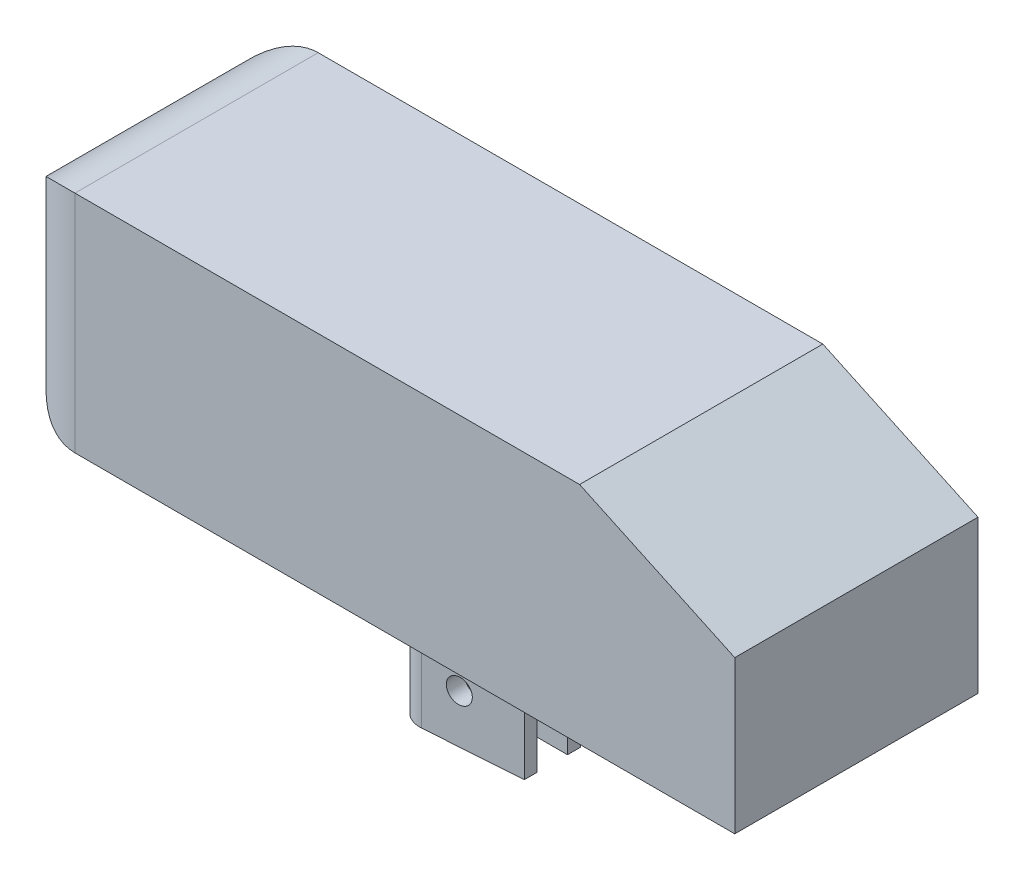
ISO-10303-21;
HEADER;
FILE_DESCRIPTION(('STEP AP214'),'2;1');
FILE_NAME('part.step','',(''),(''),'','','');
FILE_SCHEMA(('AUTOMOTIVE_DESIGN { 1 0 10303 214 1 1 1 1 }'));
ENDSEC;
DATA;
#1=APPLICATION_CONTEXT('core data for automotive mechanical design processes');
#2=APPLICATION_PROTOCOL_DEFINITION('international standard','automotive_design',2000,#1);
#3=PRODUCT_CONTEXT('',#1,'mechanical');
#4=PRODUCT('Part','Part','',(#3));
#5=PRODUCT_RELATED_PRODUCT_CATEGORY('part','',(#4));
#6=PRODUCT_DEFINITION_FORMATION('','',#4);
#7=PRODUCT_DEFINITION_CONTEXT('part definition',#1,'design');
#8=PRODUCT_DEFINITION('design','',#6,#7);
#9=PRODUCT_DEFINITION_SHAPE('','',#8);
#10=(LENGTH_UNIT() NAMED_UNIT(*) SI_UNIT(.MILLI.,.METRE.));
#11=(NAMED_UNIT(*) PLANE_ANGLE_UNIT() SI_UNIT($,.RADIAN.));
#12=(NAMED_UNIT(*) SI_UNIT($,.STERADIAN.) SOLID_ANGLE_UNIT());
#13=UNCERTAINTY_MEASURE_WITH_UNIT(LENGTH_MEASURE(1.E-05),#10,'distance_accuracy_value','');
#14=(GEOMETRIC_REPRESENTATION_CONTEXT(3) GLOBAL_UNCERTAINTY_ASSIGNED_CONTEXT((#13)) GLOBAL_UNIT_ASSIGNED_CONTEXT((#10,
#11,#12)) REPRESENTATION_CONTEXT('',''));
#15=CARTESIAN_POINT('',(0.,0.,0.));
#16=DIRECTION('',(0.,0.,1.));
#17=DIRECTION('',(1.,0.,0.));
#18=AXIS2_PLACEMENT_3D('',#15,#16,#17);
#19=CARTESIAN_POINT('',(5.59465020505335,113.389734504571,-6.));
#20=DIRECTION('',(-1.,0.,0.));
#21=DIRECTION('',(0.,0.,1.));
#22=AXIS2_PLACEMENT_3D('',#19,#20,#21);
#23=PLANE('',#22);
#24=DIRECTION('',(0.,0.,1.));
#25=VECTOR('',#24,1.);
#26=CARTESIAN_POINT('',(5.59465020505335,113.389734504571,-6.));
#27=LINE('',#26,#25);
#28=CARTESIAN_POINT('',(5.59465020505334,113.389734504571,-4.60146376112993));
#29=VERTEX_POINT('',#28);
#30=CARTESIAN_POINT('',(5.59465020505335,113.389734504571,-2.5));
#31=VERTEX_POINT('',#30);
#32=EDGE_CURVE('E167',#29,#31,#27,.T.);
#33=ORIENTED_EDGE('',*,*,#32,.F.);
#34=DIRECTION('',(0.,1.,0.));
#35=VECTOR('',#34,1.);
#36=CARTESIAN_POINT('',(5.59465020505335,113.389734504571,-4.60146376112993));
#37=LINE('',#36,#35);
#38=CARTESIAN_POINT('',(5.59465020505335,138.389734504571,-4.60146376112993));
#39=VERTEX_POINT('',#38);
#40=EDGE_CURVE('E146',#29,#39,#37,.T.);
#41=ORIENTED_EDGE('',*,*,#40,.T.);
#42=DIRECTION('',(0.,0.,1.));
#43=VECTOR('',#42,1.);
#44=CARTESIAN_POINT('',(5.59465020505335,138.389734504571,-6.));
#45=LINE('',#44,#43);
#46=CARTESIAN_POINT('',(5.59465020505335,138.389734504571,-2.5));
#47=VERTEX_POINT('',#46);
#48=EDGE_CURVE('E182',#39,#47,#45,.T.);
#49=ORIENTED_EDGE('',*,*,#48,.T.);
#50=DIRECTION('',(0.,1.,0.));
#51=VECTOR('',#50,1.);
#52=CARTESIAN_POINT('',(5.59465020505335,113.389734504571,-2.5));
#53=LINE('',#52,#51);
#54=EDGE_CURVE('E173',#31,#47,#53,.T.);
#55=ORIENTED_EDGE('',*,*,#54,.F.);
#56=EDGE_LOOP('',(#33,#41,#49,#55));
#57=FACE_BOUND('',#56,.T.);
#58=ADVANCED_FACE('F42',(#57),#23,.F.);
#59=CARTESIAN_POINT('',(5.59465020505335,138.389734504571,2.50000000000001));
#60=VERTEX_POINT('',#59);
#61=CARTESIAN_POINT('',(5.59465020505336,138.389734504571,4.60146376112993));
#62=VERTEX_POINT('',#61);
#63=EDGE_CURVE('E186',#60,#62,#45,.T.);
#64=ORIENTED_EDGE('',*,*,#63,.T.);
#65=DIRECTION('',(0.,-1.,0.));
#66=VECTOR('',#65,1.);
#67=CARTESIAN_POINT('',(5.59465020505335,113.389734504571,4.60146376112994));
#68=LINE('',#67,#66);
#69=CARTESIAN_POINT('',(5.59465020505335,113.389734504571,4.60146376112994));
#70=VERTEX_POINT('',#69);
#71=EDGE_CURVE('E253',#62,#70,#68,.T.);
#72=ORIENTED_EDGE('',*,*,#71,.T.);
#73=CARTESIAN_POINT('',(5.59465020505335,113.389734504571,2.5));
#74=VERTEX_POINT('',#73);
#75=EDGE_CURVE('E180',#74,#70,#27,.T.);
#76=ORIENTED_EDGE('',*,*,#75,.F.);
#77=DIRECTION('',(0.,-1.,0.));
#78=VECTOR('',#77,1.);
#79=CARTESIAN_POINT('',(5.59465020505335,113.389734504571,2.5));
#80=LINE('',#79,#78);
#81=EDGE_CURVE('E269',#60,#74,#80,.T.);
#82=ORIENTED_EDGE('',*,*,#81,.F.);
#83=EDGE_LOOP('',(#64,#72,#76,#82));
#84=FACE_BOUND('',#83,.T.);
#85=ADVANCED_FACE('F284',(#84),#23,.F.);
#86=CARTESIAN_POINT('',(0.,113.389734504571,0.));
#87=DIRECTION('',(0.,-1.,0.));
#88=DIRECTION('',(0.,0.,-1.));
#89=AXIS2_PLACEMENT_3D('',#86,#87,#88);
#90=PLANE('',#89);
#91=DIRECTION('',(0.997564050259825,0.,-0.0697564737441182));
#92=VECTOR('',#91,1.);
#93=CARTESIAN_POINT('',(-14.4053497949467,113.389734504571,6.));
#94=LINE('',#93,#92);
#95=CARTESIAN_POINT('',(-10.2039180970502,113.389734504571,5.70620727576772));
#96=VERTEX_POINT('',#95);
#97=EDGE_CURVE('E172',#96,#70,#94,.T.);
#98=ORIENTED_EDGE('',*,*,#97,.F.);
#99=CARTESIAN_POINT('',(-10.4829439920267,113.389734504571,1.71595107472842));
#100=DIRECTION('',(0.,-1.,0.));
#101=DIRECTION('',(0.,0.,-1.));
#102=AXIS2_PLACEMENT_3D('',#99,#100,#101);
#103=CIRCLE('',#102,4.);
#104=CARTESIAN_POINT('',(-14.4053497949467,113.389734504571,2.5));
#105=VERTEX_POINT('',#104);
#106=EDGE_CURVE('E263',#96,#105,#103,.T.);
#107=ORIENTED_EDGE('',*,*,#106,.T.);
#108=DIRECTION('',(1.,0.,0.));
#109=VECTOR('',#108,1.);
#110=CARTESIAN_POINT('',(-24.4053497949466,113.389734504571,2.5));
#111=LINE('',#110,#109);
#112=EDGE_CURVE('E490',#105,#74,#111,.T.);
#113=ORIENTED_EDGE('',*,*,#112,.T.);
#114=ORIENTED_EDGE('',*,*,#75,.T.);
#115=EDGE_LOOP('',(#98,#107,#113,#114));
#116=FACE_BOUND('',#115,.T.);
#117=ADVANCED_FACE('F288',(#116),#90,.T.);
#118=CARTESIAN_POINT('',(-4.40534979494665,138.389734504571,0.));
#119=DIRECTION('',(0.,1.,0.));
#120=DIRECTION('',(0.,0.,1.));
#121=AXIS2_PLACEMENT_3D('',#118,#119,#120);
#122=PLANE('',#121);
#123=ORIENTED_EDGE('',*,*,#48,.F.);
#124=DIRECTION('',(-0.997564050259825,0.,-0.0697564737441185));
#125=VECTOR('',#124,1.);
#126=CARTESIAN_POINT('',(20.5946502050534,138.389734504571,-3.55256158197738));
#127=LINE('',#126,#125);
#128=CARTESIAN_POINT('',(-10.2039180970502,138.389734504571,-5.70620727576772));
#129=VERTEX_POINT('',#128);
#130=EDGE_CURVE('E157',#39,#129,#127,.T.);
#131=ORIENTED_EDGE('',*,*,#130,.T.);
#132=CARTESIAN_POINT('',(-10.4829439920267,138.389734504571,-1.71595107472842));
#133=DIRECTION('',(0.,1.,0.));
#134=DIRECTION('',(0.,0.,1.));
#135=AXIS2_PLACEMENT_3D('',#132,#133,#134);
#136=CIRCLE('',#135,4.);
#137=CARTESIAN_POINT('',(-14.4053497949467,138.389734504571,-2.5));
#138=VERTEX_POINT('',#137);
#139=EDGE_CURVE('E55',#129,#138,#136,.T.);
#140=ORIENTED_EDGE('',*,*,#139,.T.);
#141=DIRECTION('',(1.,0.,0.));
#142=VECTOR('',#141,1.);
#143=CARTESIAN_POINT('',(-24.4053497949466,138.389734504571,-2.5));
#144=LINE('',#143,#142);
#145=EDGE_CURVE('E184',#138,#47,#144,.T.);
#146=ORIENTED_EDGE('',*,*,#145,.T.);
#147=EDGE_LOOP('',(#123,#131,#140,#146));
#148=FACE_BOUND('',#147,.T.);
#149=DIRECTION('',(1.,0.,0.));
#150=VECTOR('',#149,1.);
#151=CARTESIAN_POINT('',(-24.4053497949466,138.389734504571,2.50000000000002));
#152=LINE('',#151,#150);
#153=CARTESIAN_POINT('',(-14.4053497949467,138.389734504571,2.50000000000001));
#154=VERTEX_POINT('',#153);
#155=EDGE_CURVE('E267',#154,#60,#152,.T.);
#156=ORIENTED_EDGE('',*,*,#155,.F.);
#157=CARTESIAN_POINT('',(-10.4829439920267,138.389734504571,1.71595107472844));
#158=DIRECTION('',(0.,1.,0.));
#159=DIRECTION('',(0.,0.,1.));
#160=AXIS2_PLACEMENT_3D('',#157,#158,#159);
#161=CIRCLE('',#160,4.);
#162=CARTESIAN_POINT('',(-10.2039180970502,138.389734504571,5.70620727576772));
#163=VERTEX_POINT('',#162);
#164=EDGE_CURVE('E12',#154,#163,#161,.T.);
#165=ORIENTED_EDGE('',*,*,#164,.T.);
#166=DIRECTION('',(0.997564050259825,0.,-0.0697564737441182));
#167=VECTOR('',#166,1.);
#168=CARTESIAN_POINT('',(-14.4053497949467,138.389734504571,6.));
#169=LINE('',#168,#167);
#170=EDGE_CURVE('E168',#163,#62,#169,.T.);
#171=ORIENTED_EDGE('',*,*,#170,.T.);
#172=ORIENTED_EDGE('',*,*,#63,.F.);
#173=EDGE_LOOP('',(#156,#165,#171,#172));
#174=FACE_BOUND('',#173,.T.);
#175=DIRECTION('',(1.,0.,0.));
#176=VECTOR('',#175,1.);
#177=CARTESIAN_POINT('',(-64.4353497949467,138.389734504571,20.01));
#178=LINE('',#177,#176);
#179=CARTESIAN_POINT('',(-52.9353497949467,138.389734504571,20.01));
#180=VERTEX_POINT('',#179);
#181=CARTESIAN_POINT('',(55.6246502050534,138.389734504571,20.01));
#182=VERTEX_POINT('',#181);
#183=EDGE_CURVE('E194',#180,#182,#178,.T.);
#184=ORIENTED_EDGE('',*,*,#183,.F.);
#185=DIRECTION('',(0.,0.,1.));
#186=VECTOR('',#185,1.);
#187=CARTESIAN_POINT('',(-52.9353497949467,138.389734504571,0.));
#188=LINE('',#187,#186);
#189=CARTESIAN_POINT('',(-52.9353497949467,138.389734504571,-20.01));
#190=VERTEX_POINT('',#189);
#191=EDGE_CURVE('E230',#180,#190,#188,.F.);
#192=ORIENTED_EDGE('',*,*,#191,.T.);
#193=DIRECTION('',(1.,0.,0.));
#194=VECTOR('',#193,1.);
#195=CARTESIAN_POINT('',(-64.4353497949467,138.389734504571,-20.01));
#196=LINE('',#195,#194);
#197=CARTESIAN_POINT('',(55.6246502050534,138.389734504571,-20.01));
#198=VERTEX_POINT('',#197);
#199=EDGE_CURVE('E195',#190,#198,#196,.T.);
#200=ORIENTED_EDGE('',*,*,#199,.T.);
#201=DIRECTION('',(0.,0.,1.));
#202=VECTOR('',#201,1.);
#203=CARTESIAN_POINT('',(55.6246502050534,138.389734504571,-20.01));
#204=LINE('',#203,#202);
#205=EDGE_CURVE('E200',#198,#182,#204,.T.);
#206=ORIENTED_EDGE('',*,*,#205,.T.);
#207=EDGE_LOOP('',(#184,#192,#200,#206));
#208=FACE_BOUND('',#207,.T.);
#209=ADVANCED_FACE('F262',(#148,#174,#208),#122,.F.);
#210=CARTESIAN_POINT('',(-64.4353497949467,175.408234504571,-20.01));
#211=DIRECTION('',(1.,0.,0.));
#212=DIRECTION('',(0.,0.,-1.));
#213=AXIS2_PLACEMENT_3D('',#210,#211,#212);
#214=PLANE('',#213);
#215=DIRECTION('',(0.,-1.,0.));
#216=VECTOR('',#215,1.);
#217=CARTESIAN_POINT('',(-64.4353497949467,138.389734504571,-8.51000000000003));
#218=LINE('',#217,#216);
#219=CARTESIAN_POINT('',(-64.4353497949467,163.908234504571,-8.51000000000003));
#220=VERTEX_POINT('',#219);
#221=CARTESIAN_POINT('',(-64.4353497949467,149.889734504571,-8.51000000000003));
#222=VERTEX_POINT('',#221);
#223=EDGE_CURVE('E224',#220,#222,#218,.T.);
#224=ORIENTED_EDGE('',*,*,#223,.T.);
#225=DIRECTION('',(0.,0.,1.));
#226=VECTOR('',#225,1.);
#227=CARTESIAN_POINT('',(-64.4353497949467,149.889734504571,-20.01));
#228=LINE('',#227,#226);
#229=CARTESIAN_POINT('',(-64.4353497949467,149.889734504571,8.50999999999997));
#230=VERTEX_POINT('',#229);
#231=EDGE_CURVE('E221',#222,#230,#228,.T.);
#232=ORIENTED_EDGE('',*,*,#231,.T.);
#233=DIRECTION('',(0.,-1.,0.));
#234=VECTOR('',#233,1.);
#235=CARTESIAN_POINT('',(-64.4353497949467,175.408234504571,8.50999999999997));
#236=LINE('',#235,#234);
#237=CARTESIAN_POINT('',(-64.4353497949467,163.908234504571,8.50999999999997));
#238=VERTEX_POINT('',#237);
#239=EDGE_CURVE('E219',#230,#238,#236,.F.);
#240=ORIENTED_EDGE('',*,*,#239,.T.);
#241=DIRECTION('',(0.,0.,1.));
#242=VECTOR('',#241,1.);
#243=CARTESIAN_POINT('',(-64.4353497949467,163.908234504571,-20.01));
#244=LINE('',#243,#242);
#245=EDGE_CURVE('E218',#238,#220,#244,.F.);
#246=ORIENTED_EDGE('',*,*,#245,.T.);
#247=EDGE_LOOP('',(#224,#232,#240,#246));
#248=FACE_BOUND('',#247,.T.);
#249=ADVANCED_FACE('F305',(#248),#214,.F.);
#250=CARTESIAN_POINT('',(-64.4353497949467,175.408234504571,20.01));
#251=DIRECTION('',(0.,0.,-1.));
#252=DIRECTION('',(-1.,0.,0.));
#253=AXIS2_PLACEMENT_3D('',#250,#251,#252);
#254=PLANE('',#253);
#255=DIRECTION('',(1.,0.,0.));
#256=VECTOR('',#255,1.);
#257=CARTESIAN_POINT('',(-64.4353497949467,175.408234504571,20.01));
#258=LINE('',#257,#256);
#259=CARTESIAN_POINT('',(-52.9353497949467,175.408234504571,20.01));
#260=VERTEX_POINT('',#259);
#261=CARTESIAN_POINT('',(30.0946502050532,175.408234504571,20.01));
#262=VERTEX_POINT('',#261);
#263=EDGE_CURVE('E189',#260,#262,#258,.T.);
#264=ORIENTED_EDGE('',*,*,#263,.F.);
#265=DIRECTION('',(0.,-1.,0.));
#266=VECTOR('',#265,1.);
#267=CARTESIAN_POINT('',(-52.9353497949467,175.408234504571,20.01));
#268=LINE('',#267,#266);
#269=EDGE_CURVE('E234',#260,#180,#268,.T.);
#270=ORIENTED_EDGE('',*,*,#269,.T.);
#271=ORIENTED_EDGE('',*,*,#183,.T.);
#272=DIRECTION('',(0.,-1.,0.));
#273=VECTOR('',#272,1.);
#274=CARTESIAN_POINT('',(55.6246502050534,175.408234504571,20.01));
#275=LINE('',#274,#273);
#276=CARTESIAN_POINT('',(55.6246502050534,163.503399991874,20.01));
#277=VERTEX_POINT('',#276);
#278=EDGE_CURVE('E203',#277,#182,#275,.T.);
#279=ORIENTED_EDGE('',*,*,#278,.F.);
#280=DIRECTION('',(0.906307787036651,-0.422618261740697,0.));
#281=VECTOR('',#280,1.);
#282=CARTESIAN_POINT('',(55.6246502050534,163.503399991874,20.01));
#283=LINE('',#282,#281);
#284=EDGE_CURVE('E208',#277,#262,#283,.F.);
#285=ORIENTED_EDGE('',*,*,#284,.T.);
#286=EDGE_LOOP('',(#264,#270,#271,#279,#285));
#287=FACE_BOUND('',#286,.T.);
#288=ADVANCED_FACE('F309',(#287),#254,.F.);
#289=CARTESIAN_POINT('',(55.6246502050534,175.408234504571,-20.01));
#290=DIRECTION('',(1.,0.,0.));
#291=DIRECTION('',(0.,0.,-1.));
#292=AXIS2_PLACEMENT_3D('',#289,#290,#291);
#293=PLANE('',#292);
#294=DIRECTION('',(0.,-1.,0.));
#295=VECTOR('',#294,1.);
#296=CARTESIAN_POINT('',(55.6246502050534,175.408234504571,-20.01));
#297=LINE('',#296,#295);
#298=CARTESIAN_POINT('',(55.6246502050534,163.503399991874,-20.01));
#299=VERTEX_POINT('',#298);
#300=EDGE_CURVE('E192',#299,#198,#297,.T.);
#301=ORIENTED_EDGE('',*,*,#300,.F.);
#302=DIRECTION('',(0.,0.,1.));
#303=VECTOR('',#302,1.);
#304=CARTESIAN_POINT('',(55.6246502050534,163.503399991874,-20.01));
#305=LINE('',#304,#303);
#306=EDGE_CURVE('E210',#299,#277,#305,.T.);
#307=ORIENTED_EDGE('',*,*,#306,.T.);
#308=ORIENTED_EDGE('',*,*,#278,.T.);
#309=ORIENTED_EDGE('',*,*,#205,.F.);
#310=EDGE_LOOP('',(#301,#307,#308,#309));
#311=FACE_BOUND('',#310,.T.);
#312=ADVANCED_FACE('F301',(#311),#293,.T.);
#313=CARTESIAN_POINT('',(-64.4353497949467,175.408234504571,-20.01));
#314=DIRECTION('',(0.,0.,-1.));
#315=DIRECTION('',(-1.,0.,0.));
#316=AXIS2_PLACEMENT_3D('',#313,#314,#315);
#317=PLANE('',#316);
#318=ORIENTED_EDGE('',*,*,#199,.F.);
#319=DIRECTION('',(0.,-1.,0.));
#320=VECTOR('',#319,1.);
#321=CARTESIAN_POINT('',(-52.9353497949467,175.408234504571,-20.01));
#322=LINE('',#321,#320);
#323=CARTESIAN_POINT('',(-52.9353497949467,175.408234504571,-20.01));
#324=VERTEX_POINT('',#323);
#325=EDGE_CURVE('E226',#190,#324,#322,.F.);
#326=ORIENTED_EDGE('',*,*,#325,.T.);
#327=DIRECTION('',(1.,0.,0.));
#328=VECTOR('',#327,1.);
#329=CARTESIAN_POINT('',(-64.4353497949467,175.408234504571,-20.01));
#330=LINE('',#329,#328);
#331=CARTESIAN_POINT('',(30.0946502050532,175.408234504571,-20.01));
#332=VERTEX_POINT('',#331);
#333=EDGE_CURVE('E191',#324,#332,#330,.T.);
#334=ORIENTED_EDGE('',*,*,#333,.T.);
#335=DIRECTION('',(-0.906307787036651,0.422618261740697,0.));
#336=VECTOR('',#335,1.);
#337=CARTESIAN_POINT('',(-47.5517061667811,211.615325108589,-20.01));
#338=LINE('',#337,#336);
#339=EDGE_CURVE('E217',#332,#299,#338,.F.);
#340=ORIENTED_EDGE('',*,*,#339,.T.);
#341=ORIENTED_EDGE('',*,*,#300,.T.);
#342=EDGE_LOOP('',(#318,#326,#334,#340,#341));
#343=FACE_BOUND('',#342,.T.);
#344=ADVANCED_FACE('F300',(#343),#317,.T.);
#345=CARTESIAN_POINT('',(-4.40534979494665,175.408234504571,0.));
#346=DIRECTION('',(0.,1.,0.));
#347=DIRECTION('',(0.,0.,1.));
#348=AXIS2_PLACEMENT_3D('',#345,#346,#347);
#349=PLANE('',#348);
#350=ORIENTED_EDGE('',*,*,#333,.F.);
#351=DIRECTION('',(0.,0.,1.));
#352=VECTOR('',#351,1.);
#353=CARTESIAN_POINT('',(-52.9353497949467,175.408234504571,20.01));
#354=LINE('',#353,#352);
#355=EDGE_CURVE('E235',#324,#260,#354,.T.);
#356=ORIENTED_EDGE('',*,*,#355,.T.);
#357=ORIENTED_EDGE('',*,*,#263,.T.);
#358=DIRECTION('',(0.,0.,-1.));
#359=VECTOR('',#358,1.);
#360=CARTESIAN_POINT('',(30.0946502050532,175.408234504571,0.));
#361=LINE('',#360,#359);
#362=EDGE_CURVE('E215',#262,#332,#361,.T.);
#363=ORIENTED_EDGE('',*,*,#362,.T.);
#364=EDGE_LOOP('',(#350,#356,#357,#363));
#365=FACE_BOUND('',#364,.T.);
#366=ADVANCED_FACE('F291',(#365),#349,.T.);
#367=CARTESIAN_POINT('',(55.6246502050534,163.503399991874,-20.01));
#368=DIRECTION('',(-0.422618261740697,-0.906307787036651,0.));
#369=DIRECTION('',(0.,0.,1.));
#370=AXIS2_PLACEMENT_3D('',#367,#368,#369);
#371=PLANE('',#370);
#372=ORIENTED_EDGE('',*,*,#339,.F.);
#373=ORIENTED_EDGE('',*,*,#362,.F.);
#374=ORIENTED_EDGE('',*,*,#284,.F.);
#375=ORIENTED_EDGE('',*,*,#306,.F.);
#376=EDGE_LOOP('',(#372,#373,#374,#375));
#377=FACE_BOUND('',#376,.T.);
#378=ADVANCED_FACE('F299',(#377),#371,.F.);
#379=CARTESIAN_POINT('',(-52.9353497949467,163.908234504571,0.));
#380=DIRECTION('',(0.,0.,-1.));
#381=DIRECTION('',(-1.,0.,0.));
#382=AXIS2_PLACEMENT_3D('',#379,#380,#381);
#383=CYLINDRICAL_SURFACE('',#382,11.5);
#384=CARTESIAN_POINT('',(-52.9353497949467,163.908234504571,8.50999999999997));
#385=DIRECTION('',(0.,-0.707106781186547,0.707106781186547));
#386=DIRECTION('',(0.,-0.707106781186547,-0.707106781186547));
#387=AXIS2_PLACEMENT_3D('',#384,#385,#386);
#388=ELLIPSE('',#387,16.2634559672906,11.5);
#389=EDGE_CURVE('E240',#260,#238,#388,.T.);
#390=ORIENTED_EDGE('',*,*,#389,.F.);
#391=ORIENTED_EDGE('',*,*,#355,.F.);
#392=CARTESIAN_POINT('',(-52.9353497949467,163.908234504571,-8.51000000000003));
#393=DIRECTION('',(0.,-0.707106781186547,-0.707106781186547));
#394=DIRECTION('',(0.,0.707106781186547,-0.707106781186547));
#395=AXIS2_PLACEMENT_3D('',#392,#393,#394);
#396=ELLIPSE('',#395,16.2634559672906,11.5);
#397=EDGE_CURVE('E198',#220,#324,#396,.T.);
#398=ORIENTED_EDGE('',*,*,#397,.F.);
#399=ORIENTED_EDGE('',*,*,#245,.F.);
#400=EDGE_LOOP('',(#390,#391,#398,#399));
#401=FACE_BOUND('',#400,.T.);
#402=ADVANCED_FACE('F316',(#401),#383,.T.);
#403=CARTESIAN_POINT('',(-52.9353497949467,175.408234504571,-8.51000000000003));
#404=DIRECTION('',(0.,1.,0.));
#405=DIRECTION('',(0.,0.,1.));
#406=AXIS2_PLACEMENT_3D('',#403,#404,#405);
#407=CYLINDRICAL_SURFACE('',#406,11.5);
#408=ORIENTED_EDGE('',*,*,#397,.T.);
#409=ORIENTED_EDGE('',*,*,#325,.F.);
#410=CARTESIAN_POINT('',(-52.9353497949467,149.889734504571,-8.51000000000003));
#411=DIRECTION('',(0.,0.707106781186547,-0.707106781186547));
#412=DIRECTION('',(0.,0.707106781186547,0.707106781186547));
#413=AXIS2_PLACEMENT_3D('',#410,#411,#412);
#414=ELLIPSE('',#413,16.2634559672906,11.5);
#415=EDGE_CURVE('E179',#222,#190,#414,.F.);
#416=ORIENTED_EDGE('',*,*,#415,.F.);
#417=ORIENTED_EDGE('',*,*,#223,.F.);
#418=EDGE_LOOP('',(#408,#409,#416,#417));
#419=FACE_BOUND('',#418,.T.);
#420=ADVANCED_FACE('F330',(#419),#407,.T.);
#421=CARTESIAN_POINT('',(-52.9353497949467,175.408234504571,8.50999999999997));
#422=DIRECTION('',(0.,-1.,0.));
#423=DIRECTION('',(0.,0.,-1.));
#424=AXIS2_PLACEMENT_3D('',#421,#422,#423);
#425=CYLINDRICAL_SURFACE('',#424,11.5);
#426=ORIENTED_EDGE('',*,*,#389,.T.);
#427=ORIENTED_EDGE('',*,*,#239,.F.);
#428=CARTESIAN_POINT('',(-52.9353497949467,149.889734504571,8.50999999999997));
#429=DIRECTION('',(0.,-0.707106781186547,-0.707106781186547));
#430=DIRECTION('',(0.,-0.707106781186547,0.707106781186547));
#431=AXIS2_PLACEMENT_3D('',#428,#429,#430);
#432=ELLIPSE('',#431,16.2634559672906,11.5);
#433=EDGE_CURVE('E177',#180,#230,#432,.T.);
#434=ORIENTED_EDGE('',*,*,#433,.F.);
#435=ORIENTED_EDGE('',*,*,#269,.F.);
#436=EDGE_LOOP('',(#426,#427,#434,#435));
#437=FACE_BOUND('',#436,.T.);
#438=ADVANCED_FACE('F325',(#437),#425,.T.);
#439=CARTESIAN_POINT('',(-52.9353497949467,149.889734504571,-20.01));
#440=DIRECTION('',(0.,0.,1.));
#441=DIRECTION('',(1.,0.,0.));
#442=AXIS2_PLACEMENT_3D('',#439,#440,#441);
#443=CYLINDRICAL_SURFACE('',#442,11.5);
#444=ORIENTED_EDGE('',*,*,#415,.T.);
#445=ORIENTED_EDGE('',*,*,#191,.F.);
#446=ORIENTED_EDGE('',*,*,#433,.T.);
#447=ORIENTED_EDGE('',*,*,#231,.F.);
#448=EDGE_LOOP('',(#444,#445,#446,#447));
#449=FACE_BOUND('',#448,.T.);
#450=ADVANCED_FACE('F322',(#449),#443,.T.);
#451=DIRECTION('',(1.,0.,0.));
#452=VECTOR('',#451,1.);
#453=CARTESIAN_POINT('',(-24.4053497949466,113.389734504571,-2.5));
#454=LINE('',#453,#452);
#455=CARTESIAN_POINT('',(-14.4053497949467,113.389734504571,-2.5));
#456=VERTEX_POINT('',#455);
#457=EDGE_CURVE('E484',#456,#31,#454,.T.);
#458=ORIENTED_EDGE('',*,*,#457,.F.);
#459=CARTESIAN_POINT('',(-10.4829439920267,113.389734504571,-1.71595107472842));
#460=DIRECTION('',(0.,-1.,0.));
#461=DIRECTION('',(0.,0.,-1.));
#462=AXIS2_PLACEMENT_3D('',#459,#460,#461);
#463=CIRCLE('',#462,4.);
#464=CARTESIAN_POINT('',(-10.2039180970502,113.389734504571,-5.70620727576772));
#465=VERTEX_POINT('',#464);
#466=EDGE_CURVE('E166',#456,#465,#463,.T.);
#467=ORIENTED_EDGE('',*,*,#466,.T.);
#468=DIRECTION('',(-0.997564050259825,0.,-0.0697564737441185));
#469=VECTOR('',#468,1.);
#470=CARTESIAN_POINT('',(20.5946502050534,113.389734504571,-3.55256158197738));
#471=LINE('',#470,#469);
#472=EDGE_CURVE('E153',#29,#465,#471,.T.);
#473=ORIENTED_EDGE('',*,*,#472,.F.);
#474=ORIENTED_EDGE('',*,*,#32,.T.);
#475=EDGE_LOOP('',(#458,#467,#473,#474));
#476=FACE_BOUND('',#475,.T.);
#477=ADVANCED_FACE('F162',(#476),#90,.T.);
#478=CARTESIAN_POINT('',(-24.4053497949466,113.389734504571,-2.5));
#479=DIRECTION('',(0.,0.,-1.));
#480=DIRECTION('',(-1.,0.,0.));
#481=AXIS2_PLACEMENT_3D('',#478,#479,#480);
#482=PLANE('',#481);
#483=CARTESIAN_POINT('',(-4.40534979494665,121.389734504571,-2.5));
#484=DIRECTION('',(0.,0.,-1.));
#485=DIRECTION('',(-1.,0.,0.));
#486=AXIS2_PLACEMENT_3D('',#483,#484,#485);
#487=CIRCLE('',#486,2.);
#488=CARTESIAN_POINT('',(-6.40534979494665,121.389734504571,-2.5));
#489=VERTEX_POINT('',#488);
#490=EDGE_CURVE('E255',#489,#489,#487,.T.);
#491=ORIENTED_EDGE('',*,*,#490,.T.);
#492=EDGE_LOOP('',(#491));
#493=FACE_BOUND('',#492,.T.);
#494=ORIENTED_EDGE('',*,*,#457,.T.);
#495=ORIENTED_EDGE('',*,*,#54,.T.);
#496=ORIENTED_EDGE('',*,*,#145,.F.);
#497=DIRECTION('',(0.,1.,0.));
#498=VECTOR('',#497,1.);
#499=CARTESIAN_POINT('',(-14.4053497949467,113.389734504571,-2.5));
#500=LINE('',#499,#498);
#501=EDGE_CURVE('E243',#456,#138,#500,.T.);
#502=ORIENTED_EDGE('',*,*,#501,.F.);
#503=EDGE_LOOP('',(#494,#495,#496,#502));
#504=FACE_BOUND('',#503,.T.);
#505=ADVANCED_FACE('F268',(#493,#504),#482,.F.);
#506=CARTESIAN_POINT('',(-24.4053497949466,113.389734504571,2.5));
#507=DIRECTION('',(0.,0.,1.));
#508=DIRECTION('',(0.,-1.,0.));
#509=AXIS2_PLACEMENT_3D('',#506,#507,#508);
#510=PLANE('',#509);
#511=CARTESIAN_POINT('',(-4.40534979494665,121.389734504571,2.5));
#512=DIRECTION('',(0.,0.,1.));
#513=DIRECTION('',(0.,-1.,0.));
#514=AXIS2_PLACEMENT_3D('',#511,#512,#513);
#515=CIRCLE('',#514,2.);
#516=CARTESIAN_POINT('',(-4.40534979494665,119.389734504571,2.5));
#517=VERTEX_POINT('',#516);
#518=EDGE_CURVE('E246',#517,#517,#515,.T.);
#519=ORIENTED_EDGE('',*,*,#518,.T.);
#520=EDGE_LOOP('',(#519));
#521=FACE_BOUND('',#520,.T.);
#522=ORIENTED_EDGE('',*,*,#155,.T.);
#523=ORIENTED_EDGE('',*,*,#81,.T.);
#524=ORIENTED_EDGE('',*,*,#112,.F.);
#525=DIRECTION('',(0.,-1.,0.));
#526=VECTOR('',#525,1.);
#527=CARTESIAN_POINT('',(-14.4053497949467,113.389734504571,2.5));
#528=LINE('',#527,#526);
#529=EDGE_CURVE('E233',#154,#105,#528,.T.);
#530=ORIENTED_EDGE('',*,*,#529,.F.);
#531=EDGE_LOOP('',(#522,#523,#524,#530));
#532=FACE_BOUND('',#531,.T.);
#533=ADVANCED_FACE('F423',(#521,#532),#510,.F.);
#534=CARTESIAN_POINT('',(-4.40534979494665,121.389734504571,24.));
#535=DIRECTION('',(0.,0.,-1.));
#536=DIRECTION('',(-1.,0.,0.));
#537=AXIS2_PLACEMENT_3D('',#534,#535,#536);
#538=CYLINDRICAL_SURFACE('',#537,2.);
#539=CARTESIAN_POINT('',(-4.40534979494665,121.389734504571,5.30073188056497));
#540=DIRECTION('',(-0.0697564737441182,0.,-0.997564050259825));
#541=DIRECTION('',(0.997564050259825,0.,-0.0697564737441182));
#542=AXIS2_PLACEMENT_3D('',#539,#540,#541);
#543=ELLIPSE('',#542,2.00488379616234,2.);
#544=CARTESIAN_POINT('',(-2.40534979494665,121.389734504571,5.16087825667796));
#545=VERTEX_POINT('',#544);
#546=EDGE_CURVE('E158',#545,#545,#543,.F.);
#547=ORIENTED_EDGE('',*,*,#546,.T.);
#548=EDGE_LOOP('',(#547));
#549=FACE_BOUND('',#548,.T.);
#550=ORIENTED_EDGE('',*,*,#518,.F.);
#551=EDGE_LOOP('',(#550));
#552=FACE_BOUND('',#551,.T.);
#553=ADVANCED_FACE('F435',(#549,#552),#538,.F.);
#554=CARTESIAN_POINT('',(-4.40534979494665,121.389734504571,-5.30073188056497));
#555=DIRECTION('',(-0.0697564737441185,0.,0.997564050259825));
#556=DIRECTION('',(-0.997564050259825,0.,-0.0697564737441185));
#557=AXIS2_PLACEMENT_3D('',#554,#555,#556);
#558=ELLIPSE('',#557,2.00488379616234,2.);
#559=CARTESIAN_POINT('',(-6.40534979494665,121.389734504571,-5.44058550445197));
#560=VERTEX_POINT('',#559);
#561=EDGE_CURVE('E164',#560,#560,#558,.F.);
#562=ORIENTED_EDGE('',*,*,#561,.T.);
#563=EDGE_LOOP('',(#562));
#564=FACE_BOUND('',#563,.T.);
#565=ORIENTED_EDGE('',*,*,#490,.F.);
#566=EDGE_LOOP('',(#565));
#567=FACE_BOUND('',#566,.T.);
#568=ADVANCED_FACE('F445',(#564,#567),#538,.F.);
#569=CARTESIAN_POINT('',(20.5946502050534,178.239452194914,-3.55256158197738));
#570=DIRECTION('',(-0.0697564737441185,0.,0.997564050259825));
#571=DIRECTION('',(0.997564050259825,0.,0.0697564737441185));
#572=AXIS2_PLACEMENT_3D('',#569,#570,#571);
#573=PLANE('',#572);
#574=ORIENTED_EDGE('',*,*,#561,.F.);
#575=EDGE_LOOP('',(#574));
#576=FACE_BOUND('',#575,.T.);
#577=ORIENTED_EDGE('',*,*,#472,.T.);
#578=DIRECTION('',(0.,1.,0.));
#579=VECTOR('',#578,1.);
#580=CARTESIAN_POINT('',(-10.2039180970502,178.239452194914,-5.70620727576772));
#581=LINE('',#580,#579);
#582=EDGE_CURVE('E250',#465,#129,#581,.T.);
#583=ORIENTED_EDGE('',*,*,#582,.T.);
#584=ORIENTED_EDGE('',*,*,#130,.F.);
#585=ORIENTED_EDGE('',*,*,#40,.F.);
#586=EDGE_LOOP('',(#577,#583,#584,#585));
#587=FACE_BOUND('',#586,.T.);
#588=ADVANCED_FACE('F152',(#576,#587),#573,.F.);
#589=CARTESIAN_POINT('',(-14.4053497949467,178.239452194914,6.));
#590=DIRECTION('',(-0.0697564737441182,0.,-0.997564050259825));
#591=DIRECTION('',(-0.997564050259825,0.,0.0697564737441182));
#592=AXIS2_PLACEMENT_3D('',#589,#590,#591);
#593=PLANE('',#592);
#594=ORIENTED_EDGE('',*,*,#546,.F.);
#595=EDGE_LOOP('',(#594));
#596=FACE_BOUND('',#595,.T.);
#597=ORIENTED_EDGE('',*,*,#170,.F.);
#598=DIRECTION('',(0.,-1.,0.));
#599=VECTOR('',#598,1.);
#600=CARTESIAN_POINT('',(-10.2039180970502,178.239452194914,5.70620727576772));
#601=LINE('',#600,#599);
#602=EDGE_CURVE('E56',#163,#96,#601,.T.);
#603=ORIENTED_EDGE('',*,*,#602,.T.);
#604=ORIENTED_EDGE('',*,*,#97,.T.);
#605=ORIENTED_EDGE('',*,*,#71,.F.);
#606=EDGE_LOOP('',(#597,#603,#604,#605));
#607=FACE_BOUND('',#606,.T.);
#608=ADVANCED_FACE('F273',(#596,#607),#593,.F.);
#609=CARTESIAN_POINT('',(-10.4829439920267,113.389734504571,-1.71595107472842));
#610=DIRECTION('',(0.,1.,0.));
#611=DIRECTION('',(0.,0.,1.));
#612=AXIS2_PLACEMENT_3D('',#609,#610,#611);
#613=CYLINDRICAL_SURFACE('',#612,4.);
#614=ORIENTED_EDGE('',*,*,#466,.F.);
#615=ORIENTED_EDGE('',*,*,#501,.T.);
#616=ORIENTED_EDGE('',*,*,#139,.F.);
#617=ORIENTED_EDGE('',*,*,#582,.F.);
#618=EDGE_LOOP('',(#614,#615,#616,#617));
#619=FACE_BOUND('',#618,.T.);
#620=ADVANCED_FACE('F271',(#619),#613,.T.);
#621=CARTESIAN_POINT('',(-10.4829439920267,113.389734504571,1.71595107472842));
#622=DIRECTION('',(0.,-1.,0.));
#623=DIRECTION('',(0.,0.,-1.));
#624=AXIS2_PLACEMENT_3D('',#621,#622,#623);
#625=CYLINDRICAL_SURFACE('',#624,4.);
#626=ORIENTED_EDGE('',*,*,#106,.F.);
#627=ORIENTED_EDGE('',*,*,#602,.F.);
#628=ORIENTED_EDGE('',*,*,#164,.F.);
#629=ORIENTED_EDGE('',*,*,#529,.T.);
#630=EDGE_LOOP('',(#626,#627,#628,#629));
#631=FACE_BOUND('',#630,.T.);
#632=ADVANCED_FACE('F46',(#631),#625,.T.);
#633=CLOSED_SHELL('',(#58,#85,#117,#209,#249,#288,#312,#344,#366,#378,#402,#420,#438,#450,#477,
#505,#533,#553,#568,#588,#608,#620,#632));
#634=MANIFOLD_SOLID_BREP('B2',#633);
#635=ADVANCED_BREP_SHAPE_REPRESENTATION('',(#18,#634),#14);
#636=SHAPE_DEFINITION_REPRESENTATION(#9,#635);
ENDSEC;
END-ISO-10303-21;
